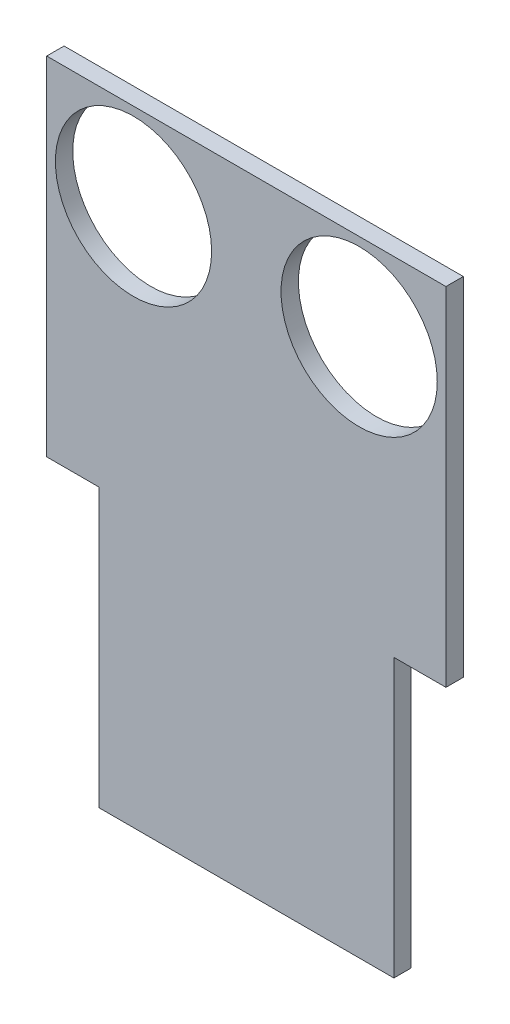
ISO-10303-21;
HEADER;
FILE_DESCRIPTION(('STEP AP214'),'2;1');
FILE_NAME('part.step','',(''),(''),'','','');
FILE_SCHEMA(('AUTOMOTIVE_DESIGN { 1 0 10303 214 1 1 1 1 }'));
ENDSEC;
DATA;
#1=APPLICATION_CONTEXT('core data for automotive mechanical design processes');
#2=APPLICATION_PROTOCOL_DEFINITION('international standard','automotive_design',2000,#1);
#3=PRODUCT_CONTEXT('',#1,'mechanical');
#4=PRODUCT('Part','Part','',(#3));
#5=PRODUCT_RELATED_PRODUCT_CATEGORY('part','',(#4));
#6=PRODUCT_DEFINITION_FORMATION('','',#4);
#7=PRODUCT_DEFINITION_CONTEXT('part definition',#1,'design');
#8=PRODUCT_DEFINITION('design','',#6,#7);
#9=PRODUCT_DEFINITION_SHAPE('','',#8);
#10=(LENGTH_UNIT() NAMED_UNIT(*) SI_UNIT(.MILLI.,.METRE.));
#11=(NAMED_UNIT(*) PLANE_ANGLE_UNIT() SI_UNIT($,.RADIAN.));
#12=(NAMED_UNIT(*) SI_UNIT($,.STERADIAN.) SOLID_ANGLE_UNIT());
#13=UNCERTAINTY_MEASURE_WITH_UNIT(LENGTH_MEASURE(1.E-05),#10,'distance_accuracy_value','');
#14=(GEOMETRIC_REPRESENTATION_CONTEXT(3) GLOBAL_UNCERTAINTY_ASSIGNED_CONTEXT((#13)) GLOBAL_UNIT_ASSIGNED_CONTEXT((#10,
#11,#12)) REPRESENTATION_CONTEXT('',''));
#15=CARTESIAN_POINT('',(0.,0.,0.));
#16=DIRECTION('',(0.,0.,1.));
#17=DIRECTION('',(1.,0.,0.));
#18=AXIS2_PLACEMENT_3D('',#15,#16,#17);
#19=CARTESIAN_POINT('',(0.,36.,2.));
#20=DIRECTION('',(0.,-1.,0.));
#21=DIRECTION('',(0.,0.,-1.));
#22=AXIS2_PLACEMENT_3D('',#19,#20,#21);
#23=PLANE('',#22);
#24=DIRECTION('',(-1.,0.,0.));
#25=VECTOR('',#24,1.);
#26=CARTESIAN_POINT('',(0.,36.,0.));
#27=LINE('',#26,#25);
#28=CARTESIAN_POINT('',(23.,36.,0.));
#29=VERTEX_POINT('',#28);
#30=CARTESIAN_POINT('',(-23.,36.,0.));
#31=VERTEX_POINT('',#30);
#32=EDGE_CURVE('E140',#29,#31,#27,.T.);
#33=ORIENTED_EDGE('',*,*,#32,.T.);
#34=DIRECTION('',(0.,0.,-1.));
#35=VECTOR('',#34,1.);
#36=CARTESIAN_POINT('',(-23.,36.,2.));
#37=LINE('',#36,#35);
#38=CARTESIAN_POINT('',(-23.,36.,2.));
#39=VERTEX_POINT('',#38);
#40=EDGE_CURVE('E11',#39,#31,#37,.T.);
#41=ORIENTED_EDGE('',*,*,#40,.F.);
#42=DIRECTION('',(-1.,0.,0.));
#43=VECTOR('',#42,1.);
#44=CARTESIAN_POINT('',(0.,36.,2.));
#45=LINE('',#44,#43);
#46=CARTESIAN_POINT('',(23.,36.,2.));
#47=VERTEX_POINT('',#46);
#48=EDGE_CURVE('E335',#47,#39,#45,.T.);
#49=ORIENTED_EDGE('',*,*,#48,.F.);
#50=DIRECTION('',(0.,0.,-1.));
#51=VECTOR('',#50,1.);
#52=CARTESIAN_POINT('',(23.,36.,2.));
#53=LINE('',#52,#51);
#54=EDGE_CURVE('E52',#47,#29,#53,.T.);
#55=ORIENTED_EDGE('',*,*,#54,.T.);
#56=EDGE_LOOP('',(#33,#41,#49,#55));
#57=FACE_BOUND('',#56,.T.);
#58=ADVANCED_FACE('F35',(#57),#23,.F.);
#59=CARTESIAN_POINT('',(-23.,0.,2.));
#60=DIRECTION('',(1.,0.,0.));
#61=DIRECTION('',(0.,1.,0.));
#62=AXIS2_PLACEMENT_3D('',#59,#60,#61);
#63=PLANE('',#62);
#64=DIRECTION('',(0.,-1.,0.));
#65=VECTOR('',#64,1.);
#66=CARTESIAN_POINT('',(-23.,0.,0.));
#67=LINE('',#66,#65);
#68=CARTESIAN_POINT('',(-23.,-4.,0.));
#69=VERTEX_POINT('',#68);
#70=EDGE_CURVE('E142',#31,#69,#67,.T.);
#71=ORIENTED_EDGE('',*,*,#70,.T.);
#72=DIRECTION('',(0.,0.,-1.));
#73=VECTOR('',#72,1.);
#74=CARTESIAN_POINT('',(-23.,-4.,2.));
#75=LINE('',#74,#73);
#76=CARTESIAN_POINT('',(-23.,-4.,2.));
#77=VERTEX_POINT('',#76);
#78=EDGE_CURVE('E44',#77,#69,#75,.T.);
#79=ORIENTED_EDGE('',*,*,#78,.F.);
#80=DIRECTION('',(0.,-1.,0.));
#81=VECTOR('',#80,1.);
#82=CARTESIAN_POINT('',(-23.,0.,2.));
#83=LINE('',#82,#81);
#84=EDGE_CURVE('E91',#39,#77,#83,.T.);
#85=ORIENTED_EDGE('',*,*,#84,.F.);
#86=ORIENTED_EDGE('',*,*,#40,.T.);
#87=EDGE_LOOP('',(#71,#79,#85,#86));
#88=FACE_BOUND('',#87,.T.);
#89=ADVANCED_FACE('F197',(#88),#63,.F.);
#90=CARTESIAN_POINT('',(0.,-4.,2.));
#91=DIRECTION('',(0.,1.,0.));
#92=DIRECTION('',(0.,0.,1.));
#93=AXIS2_PLACEMENT_3D('',#90,#91,#92);
#94=PLANE('',#93);
#95=DIRECTION('',(1.,0.,0.));
#96=VECTOR('',#95,1.);
#97=CARTESIAN_POINT('',(0.,-4.,0.));
#98=LINE('',#97,#96);
#99=CARTESIAN_POINT('',(-17.,-4.,0.));
#100=VERTEX_POINT('',#99);
#101=EDGE_CURVE('E144',#69,#100,#98,.T.);
#102=ORIENTED_EDGE('',*,*,#101,.T.);
#103=DIRECTION('',(0.,0.,-1.));
#104=VECTOR('',#103,1.);
#105=CARTESIAN_POINT('',(-17.,-4.,2.));
#106=LINE('',#105,#104);
#107=CARTESIAN_POINT('',(-17.,-4.,2.));
#108=VERTEX_POINT('',#107);
#109=EDGE_CURVE('E164',#108,#100,#106,.T.);
#110=ORIENTED_EDGE('',*,*,#109,.F.);
#111=DIRECTION('',(1.,0.,0.));
#112=VECTOR('',#111,1.);
#113=CARTESIAN_POINT('',(0.,-4.,2.));
#114=LINE('',#113,#112);
#115=EDGE_CURVE('E172',#77,#108,#114,.T.);
#116=ORIENTED_EDGE('',*,*,#115,.F.);
#117=ORIENTED_EDGE('',*,*,#78,.T.);
#118=EDGE_LOOP('',(#102,#110,#116,#117));
#119=FACE_BOUND('',#118,.T.);
#120=ADVANCED_FACE('F170',(#119),#94,.F.);
#121=CARTESIAN_POINT('',(-17.,0.,2.));
#122=DIRECTION('',(1.,0.,0.));
#123=DIRECTION('',(0.,1.,0.));
#124=AXIS2_PLACEMENT_3D('',#121,#122,#123);
#125=PLANE('',#124);
#126=DIRECTION('',(0.,-1.,0.));
#127=VECTOR('',#126,1.);
#128=CARTESIAN_POINT('',(-17.,0.,0.));
#129=LINE('',#128,#127);
#130=CARTESIAN_POINT('',(-17.,-36.,0.));
#131=VERTEX_POINT('',#130);
#132=EDGE_CURVE('E146',#100,#131,#129,.T.);
#133=ORIENTED_EDGE('',*,*,#132,.T.);
#134=DIRECTION('',(0.,0.,-1.));
#135=VECTOR('',#134,1.);
#136=CARTESIAN_POINT('',(-17.,-36.,2.));
#137=LINE('',#136,#135);
#138=CARTESIAN_POINT('',(-17.,-36.,2.));
#139=VERTEX_POINT('',#138);
#140=EDGE_CURVE('E161',#139,#131,#137,.T.);
#141=ORIENTED_EDGE('',*,*,#140,.F.);
#142=DIRECTION('',(0.,-1.,0.));
#143=VECTOR('',#142,1.);
#144=CARTESIAN_POINT('',(-17.,0.,2.));
#145=LINE('',#144,#143);
#146=EDGE_CURVE('E129',#108,#139,#145,.T.);
#147=ORIENTED_EDGE('',*,*,#146,.F.);
#148=ORIENTED_EDGE('',*,*,#109,.T.);
#149=EDGE_LOOP('',(#133,#141,#147,#148));
#150=FACE_BOUND('',#149,.T.);
#151=ADVANCED_FACE('F179',(#150),#125,.F.);
#152=CARTESIAN_POINT('',(0.,-36.,2.));
#153=DIRECTION('',(0.,1.,0.));
#154=DIRECTION('',(0.,0.,1.));
#155=AXIS2_PLACEMENT_3D('',#152,#153,#154);
#156=PLANE('',#155);
#157=DIRECTION('',(1.,0.,0.));
#158=VECTOR('',#157,1.);
#159=CARTESIAN_POINT('',(0.,-36.,0.));
#160=LINE('',#159,#158);
#161=CARTESIAN_POINT('',(17.,-36.,0.));
#162=VERTEX_POINT('',#161);
#163=EDGE_CURVE('E148',#131,#162,#160,.T.);
#164=ORIENTED_EDGE('',*,*,#163,.T.);
#165=DIRECTION('',(0.,0.,-1.));
#166=VECTOR('',#165,1.);
#167=CARTESIAN_POINT('',(17.,-36.,2.));
#168=LINE('',#167,#166);
#169=CARTESIAN_POINT('',(17.,-36.,2.));
#170=VERTEX_POINT('',#169);
#171=EDGE_CURVE('E116',#170,#162,#168,.T.);
#172=ORIENTED_EDGE('',*,*,#171,.F.);
#173=DIRECTION('',(1.,0.,0.));
#174=VECTOR('',#173,1.);
#175=CARTESIAN_POINT('',(0.,-36.,2.));
#176=LINE('',#175,#174);
#177=EDGE_CURVE('E126',#139,#170,#176,.T.);
#178=ORIENTED_EDGE('',*,*,#177,.F.);
#179=ORIENTED_EDGE('',*,*,#140,.T.);
#180=EDGE_LOOP('',(#164,#172,#178,#179));
#181=FACE_BOUND('',#180,.T.);
#182=ADVANCED_FACE('F182',(#181),#156,.F.);
#183=CARTESIAN_POINT('',(17.,0.,2.));
#184=DIRECTION('',(1.,0.,0.));
#185=DIRECTION('',(0.,1.,0.));
#186=AXIS2_PLACEMENT_3D('',#183,#184,#185);
#187=PLANE('',#186);
#188=DIRECTION('',(0.,-1.,0.));
#189=VECTOR('',#188,1.);
#190=CARTESIAN_POINT('',(17.,0.,0.));
#191=LINE('',#190,#189);
#192=CARTESIAN_POINT('',(17.,-4.,0.));
#193=VERTEX_POINT('',#192);
#194=EDGE_CURVE('E113',#193,#162,#191,.T.);
#195=ORIENTED_EDGE('',*,*,#194,.F.);
#196=DIRECTION('',(0.,0.,-1.));
#197=VECTOR('',#196,1.);
#198=CARTESIAN_POINT('',(17.,-4.,2.));
#199=LINE('',#198,#197);
#200=CARTESIAN_POINT('',(17.,-4.,2.));
#201=VERTEX_POINT('',#200);
#202=EDGE_CURVE('E107',#201,#193,#199,.T.);
#203=ORIENTED_EDGE('',*,*,#202,.F.);
#204=DIRECTION('',(0.,-1.,0.));
#205=VECTOR('',#204,1.);
#206=CARTESIAN_POINT('',(17.,0.,2.));
#207=LINE('',#206,#205);
#208=EDGE_CURVE('E111',#201,#170,#207,.T.);
#209=ORIENTED_EDGE('',*,*,#208,.T.);
#210=ORIENTED_EDGE('',*,*,#171,.T.);
#211=EDGE_LOOP('',(#195,#203,#209,#210));
#212=FACE_BOUND('',#211,.T.);
#213=ADVANCED_FACE('F109',(#212),#187,.T.);
#214=CARTESIAN_POINT('',(0.,-4.,2.));
#215=DIRECTION('',(0.,1.,0.));
#216=DIRECTION('',(0.,0.,1.));
#217=AXIS2_PLACEMENT_3D('',#214,#215,#216);
#218=PLANE('',#217);
#219=DIRECTION('',(1.,0.,0.));
#220=VECTOR('',#219,1.);
#221=CARTESIAN_POINT('',(0.,-4.,0.));
#222=LINE('',#221,#220);
#223=CARTESIAN_POINT('',(23.,-4.,0.));
#224=VERTEX_POINT('',#223);
#225=EDGE_CURVE('E152',#193,#224,#222,.T.);
#226=ORIENTED_EDGE('',*,*,#225,.T.);
#227=DIRECTION('',(0.,0.,-1.));
#228=VECTOR('',#227,1.);
#229=CARTESIAN_POINT('',(23.,-4.,2.));
#230=LINE('',#229,#228);
#231=CARTESIAN_POINT('',(23.,-4.,2.));
#232=VERTEX_POINT('',#231);
#233=EDGE_CURVE('E79',#232,#224,#230,.T.);
#234=ORIENTED_EDGE('',*,*,#233,.F.);
#235=DIRECTION('',(1.,0.,0.));
#236=VECTOR('',#235,1.);
#237=CARTESIAN_POINT('',(0.,-4.,2.));
#238=LINE('',#237,#236);
#239=EDGE_CURVE('E118',#201,#232,#238,.T.);
#240=ORIENTED_EDGE('',*,*,#239,.F.);
#241=ORIENTED_EDGE('',*,*,#202,.T.);
#242=EDGE_LOOP('',(#226,#234,#240,#241));
#243=FACE_BOUND('',#242,.T.);
#244=ADVANCED_FACE('F119',(#243),#218,.F.);
#245=CARTESIAN_POINT('',(13.,26.,2.));
#246=DIRECTION('',(0.,0.,-1.));
#247=DIRECTION('',(-1.,0.,0.));
#248=AXIS2_PLACEMENT_3D('',#245,#246,#247);
#249=CYLINDRICAL_SURFACE('',#248,9.);
#250=CARTESIAN_POINT('',(13.,26.,2.));
#251=DIRECTION('',(0.,0.,1.));
#252=DIRECTION('',(1.,0.,0.));
#253=AXIS2_PLACEMENT_3D('',#250,#251,#252);
#254=CIRCLE('',#253,9.);
#255=CARTESIAN_POINT('',(22.,26.,2.));
#256=VERTEX_POINT('',#255);
#257=EDGE_CURVE('E212',#256,#256,#254,.T.);
#258=ORIENTED_EDGE('',*,*,#257,.T.);
#259=EDGE_LOOP('',(#258));
#260=FACE_BOUND('',#259,.T.);
#261=CARTESIAN_POINT('',(13.,26.,0.));
#262=DIRECTION('',(0.,0.,1.));
#263=DIRECTION('',(1.,0.,0.));
#264=AXIS2_PLACEMENT_3D('',#261,#262,#263);
#265=CIRCLE('',#264,9.);
#266=CARTESIAN_POINT('',(22.,26.,0.));
#267=VERTEX_POINT('',#266);
#268=EDGE_CURVE('E137',#267,#267,#265,.T.);
#269=ORIENTED_EDGE('',*,*,#268,.F.);
#270=EDGE_LOOP('',(#269));
#271=FACE_BOUND('',#270,.T.);
#272=ADVANCED_FACE('F192',(#260,#271),#249,.F.);
#273=CARTESIAN_POINT('',(-13.,26.,2.));
#274=DIRECTION('',(0.,0.,-1.));
#275=DIRECTION('',(-1.,0.,0.));
#276=AXIS2_PLACEMENT_3D('',#273,#274,#275);
#277=CYLINDRICAL_SURFACE('',#276,9.);
#278=CARTESIAN_POINT('',(-13.,26.,2.));
#279=DIRECTION('',(0.,0.,1.));
#280=DIRECTION('',(1.,0.,0.));
#281=AXIS2_PLACEMENT_3D('',#278,#279,#280);
#282=CIRCLE('',#281,9.);
#283=CARTESIAN_POINT('',(-4.,26.,2.));
#284=VERTEX_POINT('',#283);
#285=EDGE_CURVE('E157',#284,#284,#282,.T.);
#286=ORIENTED_EDGE('',*,*,#285,.T.);
#287=EDGE_LOOP('',(#286));
#288=FACE_BOUND('',#287,.T.);
#289=CARTESIAN_POINT('',(-13.,26.,0.));
#290=DIRECTION('',(0.,0.,1.));
#291=DIRECTION('',(1.,0.,0.));
#292=AXIS2_PLACEMENT_3D('',#289,#290,#291);
#293=CIRCLE('',#292,9.);
#294=CARTESIAN_POINT('',(-4.,26.,0.));
#295=VERTEX_POINT('',#294);
#296=EDGE_CURVE('E134',#295,#295,#293,.T.);
#297=ORIENTED_EDGE('',*,*,#296,.F.);
#298=EDGE_LOOP('',(#297));
#299=FACE_BOUND('',#298,.T.);
#300=ADVANCED_FACE('F37',(#288,#299),#277,.F.);
#301=CARTESIAN_POINT('',(23.,0.,2.));
#302=DIRECTION('',(1.,0.,0.));
#303=DIRECTION('',(0.,0.,-1.));
#304=AXIS2_PLACEMENT_3D('',#301,#302,#303);
#305=PLANE('',#304);
#306=DIRECTION('',(0.,-1.,0.));
#307=VECTOR('',#306,1.);
#308=CARTESIAN_POINT('',(23.,0.,0.));
#309=LINE('',#308,#307);
#310=EDGE_CURVE('E154',#29,#224,#309,.T.);
#311=ORIENTED_EDGE('',*,*,#310,.F.);
#312=ORIENTED_EDGE('',*,*,#54,.F.);
#313=DIRECTION('',(0.,-1.,0.));
#314=VECTOR('',#313,1.);
#315=CARTESIAN_POINT('',(23.,0.,2.));
#316=LINE('',#315,#314);
#317=EDGE_CURVE('E122',#47,#232,#316,.T.);
#318=ORIENTED_EDGE('',*,*,#317,.T.);
#319=ORIENTED_EDGE('',*,*,#233,.T.);
#320=EDGE_LOOP('',(#311,#312,#318,#319));
#321=FACE_BOUND('',#320,.T.);
#322=ADVANCED_FACE('F183',(#321),#305,.T.);
#323=CARTESIAN_POINT('',(0.,0.,2.));
#324=DIRECTION('',(0.,0.,1.));
#325=DIRECTION('',(1.,0.,0.));
#326=AXIS2_PLACEMENT_3D('',#323,#324,#325);
#327=PLANE('',#326);
#328=ORIENTED_EDGE('',*,*,#285,.F.);
#329=EDGE_LOOP('',(#328));
#330=FACE_BOUND('',#329,.T.);
#331=ORIENTED_EDGE('',*,*,#257,.F.);
#332=EDGE_LOOP('',(#331));
#333=FACE_BOUND('',#332,.T.);
#334=ORIENTED_EDGE('',*,*,#48,.T.);
#335=ORIENTED_EDGE('',*,*,#84,.T.);
#336=ORIENTED_EDGE('',*,*,#115,.T.);
#337=ORIENTED_EDGE('',*,*,#146,.T.);
#338=ORIENTED_EDGE('',*,*,#177,.T.);
#339=ORIENTED_EDGE('',*,*,#208,.F.);
#340=ORIENTED_EDGE('',*,*,#239,.T.);
#341=ORIENTED_EDGE('',*,*,#317,.F.);
#342=EDGE_LOOP('',(#334,#335,#336,#337,#338,#339,#340,#341));
#343=FACE_BOUND('',#342,.T.);
#344=ADVANCED_FACE('F124',(#330,#333,#343),#327,.T.);
#345=CARTESIAN_POINT('',(0.,0.,0.));
#346=DIRECTION('',(0.,0.,1.));
#347=DIRECTION('',(1.,0.,0.));
#348=AXIS2_PLACEMENT_3D('',#345,#346,#347);
#349=PLANE('',#348);
#350=ORIENTED_EDGE('',*,*,#296,.T.);
#351=EDGE_LOOP('',(#350));
#352=FACE_BOUND('',#351,.T.);
#353=ORIENTED_EDGE('',*,*,#268,.T.);
#354=EDGE_LOOP('',(#353));
#355=FACE_BOUND('',#354,.T.);
#356=ORIENTED_EDGE('',*,*,#32,.F.);
#357=ORIENTED_EDGE('',*,*,#310,.T.);
#358=ORIENTED_EDGE('',*,*,#225,.F.);
#359=ORIENTED_EDGE('',*,*,#194,.T.);
#360=ORIENTED_EDGE('',*,*,#163,.F.);
#361=ORIENTED_EDGE('',*,*,#132,.F.);
#362=ORIENTED_EDGE('',*,*,#101,.F.);
#363=ORIENTED_EDGE('',*,*,#70,.F.);
#364=EDGE_LOOP('',(#356,#357,#358,#359,#360,#361,#362,#363));
#365=FACE_BOUND('',#364,.T.);
#366=ADVANCED_FACE('F175',(#352,#355,#365),#349,.F.);
#367=CLOSED_SHELL('',(#58,#89,#120,#151,#182,#213,#244,#272,#300,#322,#344,#366));
#368=MANIFOLD_SOLID_BREP('B2',#367);
#369=ADVANCED_BREP_SHAPE_REPRESENTATION('',(#18,#368),#14);
#370=SHAPE_DEFINITION_REPRESENTATION(#9,#369);
ENDSEC;
END-ISO-10303-21;
